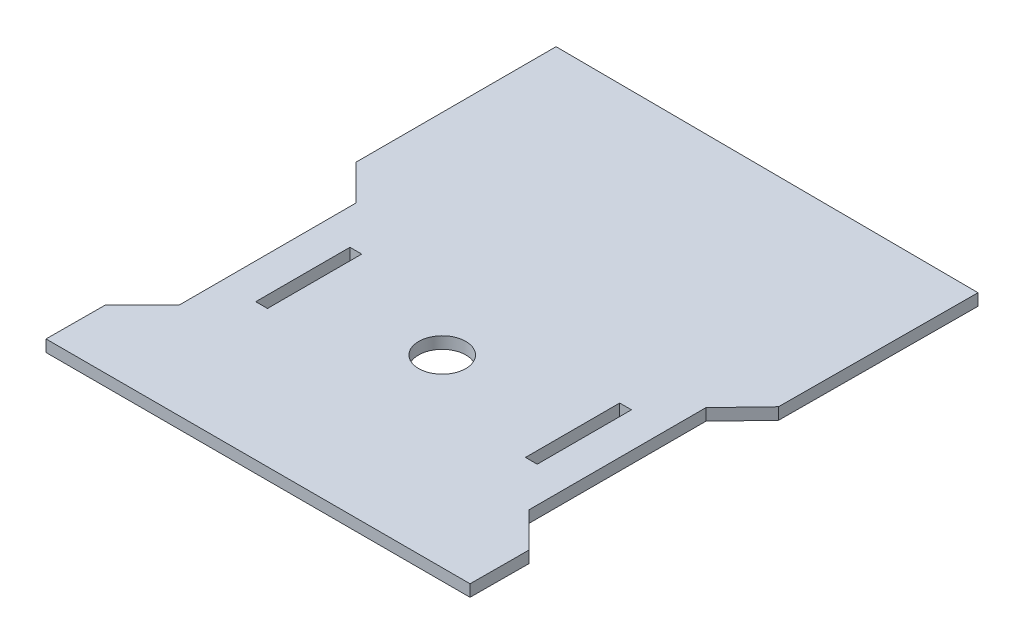
ISO-10303-21;
HEADER;
FILE_DESCRIPTION(('STEP AP214'),'2;1');
FILE_NAME('part.step','',(''),(''),'','','');
FILE_SCHEMA(('AUTOMOTIVE_DESIGN { 1 0 10303 214 1 1 1 1 }'));
ENDSEC;
DATA;
#1=APPLICATION_CONTEXT('core data for automotive mechanical design processes');
#2=APPLICATION_PROTOCOL_DEFINITION('international standard','automotive_design',2000,#1);
#3=PRODUCT_CONTEXT('',#1,'mechanical');
#4=PRODUCT('Part','Part','',(#3));
#5=PRODUCT_RELATED_PRODUCT_CATEGORY('part','',(#4));
#6=PRODUCT_DEFINITION_FORMATION('','',#4);
#7=PRODUCT_DEFINITION_CONTEXT('part definition',#1,'design');
#8=PRODUCT_DEFINITION('design','',#6,#7);
#9=PRODUCT_DEFINITION_SHAPE('','',#8);
#10=(LENGTH_UNIT() NAMED_UNIT(*) SI_UNIT(.MILLI.,.METRE.));
#11=(NAMED_UNIT(*) PLANE_ANGLE_UNIT() SI_UNIT($,.RADIAN.));
#12=(NAMED_UNIT(*) SI_UNIT($,.STERADIAN.) SOLID_ANGLE_UNIT());
#13=UNCERTAINTY_MEASURE_WITH_UNIT(LENGTH_MEASURE(1.E-05),#10,'distance_accuracy_value','');
#14=(GEOMETRIC_REPRESENTATION_CONTEXT(3) GLOBAL_UNCERTAINTY_ASSIGNED_CONTEXT((#13)) GLOBAL_UNIT_ASSIGNED_CONTEXT((#10,
#11,#12)) REPRESENTATION_CONTEXT('',''));
#15=CARTESIAN_POINT('',(0.,0.,0.));
#16=DIRECTION('',(0.,0.,1.));
#17=DIRECTION('',(1.,0.,0.));
#18=AXIS2_PLACEMENT_3D('',#15,#16,#17);
#19=CARTESIAN_POINT('',(-124.760229313885,5.,-28.8095600662507));
#20=DIRECTION('',(1.,0.,0.));
#21=DIRECTION('',(0.,0.,-1.));
#22=AXIS2_PLACEMENT_3D('',#19,#20,#21);
#23=PLANE('',#22);
#24=DIRECTION('',(0.,0.,1.));
#25=VECTOR('',#24,1.);
#26=CARTESIAN_POINT('',(-124.760229313885,0.,-28.8095600662507));
#27=LINE('',#26,#25);
#28=CARTESIAN_POINT('',(-124.760229313885,0.,-128.809560066251));
#29=VERTEX_POINT('',#28);
#30=CARTESIAN_POINT('',(-124.760229313885,0.,-43.8095600662505));
#31=VERTEX_POINT('',#30);
#32=EDGE_CURVE('E231',#29,#31,#27,.T.);
#33=ORIENTED_EDGE('',*,*,#32,.T.);
#34=DIRECTION('',(0.,1.,0.));
#35=VECTOR('',#34,1.);
#36=CARTESIAN_POINT('',(-124.760229313885,0.,-43.8095600662505));
#37=LINE('',#36,#35);
#38=CARTESIAN_POINT('',(-124.760229313885,5.,-43.8095600662505));
#39=VERTEX_POINT('',#38);
#40=EDGE_CURVE('E225',#31,#39,#37,.T.);
#41=ORIENTED_EDGE('',*,*,#40,.T.);
#42=DIRECTION('',(0.,0.,1.));
#43=VECTOR('',#42,1.);
#44=CARTESIAN_POINT('',(-124.760229313885,5.,-28.8095600662507));
#45=LINE('',#44,#43);
#46=CARTESIAN_POINT('',(-124.760229313885,5.,-128.809560066251));
#47=VERTEX_POINT('',#46);
#48=EDGE_CURVE('E237',#47,#39,#45,.T.);
#49=ORIENTED_EDGE('',*,*,#48,.F.);
#50=DIRECTION('',(0.,-1.,0.));
#51=VECTOR('',#50,1.);
#52=CARTESIAN_POINT('',(-124.760229313885,5.,-128.809560066251));
#53=LINE('',#52,#51);
#54=EDGE_CURVE('E260',#47,#29,#53,.T.);
#55=ORIENTED_EDGE('',*,*,#54,.T.);
#56=EDGE_LOOP('',(#33,#41,#49,#55));
#57=FACE_BOUND('',#56,.T.);
#58=ADVANCED_FACE('F33',(#57),#23,.F.);
#59=CARTESIAN_POINT('',(-109.760229313885,5.,46.1904399337493));
#60=DIRECTION('',(1.,0.,0.));
#61=DIRECTION('',(0.,0.,-1.));
#62=AXIS2_PLACEMENT_3D('',#59,#60,#61);
#63=PLANE('',#62);
#64=DIRECTION('',(0.,0.,1.));
#65=VECTOR('',#64,1.);
#66=CARTESIAN_POINT('',(-109.760229313885,0.,46.1904399337493));
#67=LINE('',#66,#65);
#68=CARTESIAN_POINT('',(-109.760229313885,0.,-28.8095600662507));
#69=VERTEX_POINT('',#68);
#70=CARTESIAN_POINT('',(-109.760229313885,0.,46.1904399337493));
#71=VERTEX_POINT('',#70);
#72=EDGE_CURVE('E263',#69,#71,#67,.T.);
#73=ORIENTED_EDGE('',*,*,#72,.T.);
#74=DIRECTION('',(0.,-1.,0.));
#75=VECTOR('',#74,1.);
#76=CARTESIAN_POINT('',(-109.760229313885,5.,46.1904399337493));
#77=LINE('',#76,#75);
#78=CARTESIAN_POINT('',(-109.760229313885,5.,46.1904399337493));
#79=VERTEX_POINT('',#78);
#80=EDGE_CURVE('E303',#79,#71,#77,.T.);
#81=ORIENTED_EDGE('',*,*,#80,.F.);
#82=DIRECTION('',(0.,0.,1.));
#83=VECTOR('',#82,1.);
#84=CARTESIAN_POINT('',(-109.760229313885,5.,46.1904399337493));
#85=LINE('',#84,#83);
#86=CARTESIAN_POINT('',(-109.760229313885,5.,-28.8095600662507));
#87=VERTEX_POINT('',#86);
#88=EDGE_CURVE('E240',#87,#79,#85,.T.);
#89=ORIENTED_EDGE('',*,*,#88,.F.);
#90=DIRECTION('',(0.,-1.,0.));
#91=VECTOR('',#90,1.);
#92=CARTESIAN_POINT('',(-109.760229313885,5.,-28.8095600662507));
#93=LINE('',#92,#91);
#94=EDGE_CURVE('E306',#87,#69,#93,.T.);
#95=ORIENTED_EDGE('',*,*,#94,.T.);
#96=EDGE_LOOP('',(#73,#81,#89,#95));
#97=FACE_BOUND('',#96,.T.);
#98=ADVANCED_FACE('F346',(#97),#63,.F.);
#99=CARTESIAN_POINT('',(-125.457265463883,5.,61.8874760837466));
#100=DIRECTION('',(0.707106781186546,0.,0.707106781186549));
#101=DIRECTION('',(0.707106781186549,0.,-0.707106781186546));
#102=AXIS2_PLACEMENT_3D('',#99,#100,#101);
#103=PLANE('',#102);
#104=DIRECTION('',(-0.707106781186549,0.,0.707106781186546));
#105=VECTOR('',#104,1.);
#106=CARTESIAN_POINT('',(-125.457265463883,0.,61.8874760837466));
#107=LINE('',#106,#105);
#108=CARTESIAN_POINT('',(-125.457265463883,0.,61.8874760837466));
#109=VERTEX_POINT('',#108);
#110=EDGE_CURVE('E265',#71,#109,#107,.T.);
#111=ORIENTED_EDGE('',*,*,#110,.T.);
#112=DIRECTION('',(0.,-1.,0.));
#113=VECTOR('',#112,1.);
#114=CARTESIAN_POINT('',(-125.457265463883,5.,61.8874760837466));
#115=LINE('',#114,#113);
#116=CARTESIAN_POINT('',(-125.457265463883,5.,61.8874760837466));
#117=VERTEX_POINT('',#116);
#118=EDGE_CURVE('E300',#117,#109,#115,.T.);
#119=ORIENTED_EDGE('',*,*,#118,.F.);
#120=DIRECTION('',(-0.707106781186549,0.,0.707106781186546));
#121=VECTOR('',#120,1.);
#122=CARTESIAN_POINT('',(-125.457265463883,5.,61.8874760837466));
#123=LINE('',#122,#121);
#124=EDGE_CURVE('E243',#79,#117,#123,.T.);
#125=ORIENTED_EDGE('',*,*,#124,.F.);
#126=ORIENTED_EDGE('',*,*,#80,.T.);
#127=EDGE_LOOP('',(#111,#119,#125,#126));
#128=FACE_BOUND('',#127,.T.);
#129=ADVANCED_FACE('F351',(#128),#103,.F.);
#130=CARTESIAN_POINT('',(-125.581736204954,5.,86.8874760837466));
#131=DIRECTION('',(0.99998760585812,0.,0.00497876793451781));
#132=DIRECTION('',(0.00497876793451781,0.,-0.99998760585812));
#133=AXIS2_PLACEMENT_3D('',#130,#131,#132);
#134=PLANE('',#133);
#135=DIRECTION('',(-0.00497876793451781,0.,0.99998760585812));
#136=VECTOR('',#135,1.);
#137=CARTESIAN_POINT('',(-125.581736204954,0.,86.8874760837466));
#138=LINE('',#137,#136);
#139=CARTESIAN_POINT('',(-125.581736204954,0.,86.8874760837466));
#140=VERTEX_POINT('',#139);
#141=EDGE_CURVE('E267',#109,#140,#138,.T.);
#142=ORIENTED_EDGE('',*,*,#141,.T.);
#143=DIRECTION('',(0.,-1.,0.));
#144=VECTOR('',#143,1.);
#145=CARTESIAN_POINT('',(-125.581736204954,5.,86.8874760837466));
#146=LINE('',#145,#144);
#147=CARTESIAN_POINT('',(-125.581736204954,5.,86.8874760837466));
#148=VERTEX_POINT('',#147);
#149=EDGE_CURVE('E297',#148,#140,#146,.T.);
#150=ORIENTED_EDGE('',*,*,#149,.F.);
#151=DIRECTION('',(-0.00497876793451781,0.,0.99998760585812));
#152=VECTOR('',#151,1.);
#153=CARTESIAN_POINT('',(-125.581736204954,5.,86.8874760837466));
#154=LINE('',#153,#152);
#155=EDGE_CURVE('E245',#117,#148,#154,.T.);
#156=ORIENTED_EDGE('',*,*,#155,.F.);
#157=ORIENTED_EDGE('',*,*,#118,.T.);
#158=EDGE_LOOP('',(#142,#150,#156,#157));
#159=FACE_BOUND('',#158,.T.);
#160=ADVANCED_FACE('F403',(#159),#134,.F.);
#161=CARTESIAN_POINT('',(54.4182637950463,5.,86.8874760837466));
#162=DIRECTION('',(0.,0.,-1.));
#163=DIRECTION('',(-1.,0.,0.));
#164=AXIS2_PLACEMENT_3D('',#161,#162,#163);
#165=PLANE('',#164);
#166=DIRECTION('',(1.,0.,0.));
#167=VECTOR('',#166,1.);
#168=CARTESIAN_POINT('',(54.4182637950463,0.,86.8874760837466));
#169=LINE('',#168,#167);
#170=CARTESIAN_POINT('',(54.4182637950463,0.,86.8874760837466));
#171=VERTEX_POINT('',#170);
#172=EDGE_CURVE('E269',#140,#171,#169,.T.);
#173=ORIENTED_EDGE('',*,*,#172,.T.);
#174=DIRECTION('',(0.,-1.,0.));
#175=VECTOR('',#174,1.);
#176=CARTESIAN_POINT('',(54.4182637950463,5.,86.8874760837466));
#177=LINE('',#176,#175);
#178=CARTESIAN_POINT('',(54.4182637950463,5.,86.8874760837466));
#179=VERTEX_POINT('',#178);
#180=EDGE_CURVE('E294',#179,#171,#177,.T.);
#181=ORIENTED_EDGE('',*,*,#180,.F.);
#182=DIRECTION('',(1.,0.,0.));
#183=VECTOR('',#182,1.);
#184=CARTESIAN_POINT('',(54.4182637950463,5.,86.8874760837466));
#185=LINE('',#184,#183);
#186=EDGE_CURVE('E247',#148,#179,#185,.T.);
#187=ORIENTED_EDGE('',*,*,#186,.F.);
#188=ORIENTED_EDGE('',*,*,#149,.T.);
#189=EDGE_LOOP('',(#173,#181,#187,#188));
#190=FACE_BOUND('',#189,.T.);
#191=ADVANCED_FACE('F399',(#190),#165,.F.);
#192=CARTESIAN_POINT('',(54.5427345361172,5.,61.8874760837467));
#193=DIRECTION('',(-0.99998760585812,0.,-0.0049787679345167));
#194=DIRECTION('',(-0.0049787679345167,0.,0.99998760585812));
#195=AXIS2_PLACEMENT_3D('',#192,#193,#194);
#196=PLANE('',#195);
#197=DIRECTION('',(0.0049787679345167,0.,-0.99998760585812));
#198=VECTOR('',#197,1.);
#199=CARTESIAN_POINT('',(54.5427345361172,0.,61.8874760837467));
#200=LINE('',#199,#198);
#201=CARTESIAN_POINT('',(54.5427345361172,0.,61.8874760837467));
#202=VERTEX_POINT('',#201);
#203=EDGE_CURVE('E271',#171,#202,#200,.T.);
#204=ORIENTED_EDGE('',*,*,#203,.T.);
#205=DIRECTION('',(0.,-1.,0.));
#206=VECTOR('',#205,1.);
#207=CARTESIAN_POINT('',(54.5427345361172,5.,61.8874760837467));
#208=LINE('',#207,#206);
#209=CARTESIAN_POINT('',(54.5427345361172,5.,61.8874760837467));
#210=VERTEX_POINT('',#209);
#211=EDGE_CURVE('E291',#210,#202,#208,.T.);
#212=ORIENTED_EDGE('',*,*,#211,.F.);
#213=DIRECTION('',(0.0049787679345167,0.,-0.99998760585812));
#214=VECTOR('',#213,1.);
#215=CARTESIAN_POINT('',(54.5427345361172,5.,61.8874760837467));
#216=LINE('',#215,#214);
#217=EDGE_CURVE('E249',#179,#210,#216,.T.);
#218=ORIENTED_EDGE('',*,*,#217,.F.);
#219=ORIENTED_EDGE('',*,*,#180,.T.);
#220=EDGE_LOOP('',(#204,#212,#218,#219));
#221=FACE_BOUND('',#220,.T.);
#222=ADVANCED_FACE('F394',(#221),#196,.F.);
#223=CARTESIAN_POINT('',(39.7418877218308,5.,47.0866292694603));
#224=DIRECTION('',(-0.707106781186547,0.,0.707106781186548));
#225=DIRECTION('',(0.707106781186548,0.,0.707106781186547));
#226=AXIS2_PLACEMENT_3D('',#223,#224,#225);
#227=PLANE('',#226);
#228=DIRECTION('',(-0.707106781186548,0.,-0.707106781186547));
#229=VECTOR('',#228,1.);
#230=CARTESIAN_POINT('',(39.7418877218308,0.,47.0866292694603));
#231=LINE('',#230,#229);
#232=CARTESIAN_POINT('',(39.7418877218308,0.,47.0866292694603));
#233=VERTEX_POINT('',#232);
#234=EDGE_CURVE('E273',#202,#233,#231,.T.);
#235=ORIENTED_EDGE('',*,*,#234,.T.);
#236=DIRECTION('',(0.,-1.,0.));
#237=VECTOR('',#236,1.);
#238=CARTESIAN_POINT('',(39.7418877218308,5.,47.0866292694603));
#239=LINE('',#238,#237);
#240=CARTESIAN_POINT('',(39.7418877218308,5.,47.0866292694603));
#241=VERTEX_POINT('',#240);
#242=EDGE_CURVE('E288',#241,#233,#239,.T.);
#243=ORIENTED_EDGE('',*,*,#242,.F.);
#244=DIRECTION('',(-0.707106781186548,0.,-0.707106781186547));
#245=VECTOR('',#244,1.);
#246=CARTESIAN_POINT('',(39.7418877218308,5.,47.0866292694603));
#247=LINE('',#246,#245);
#248=EDGE_CURVE('E251',#210,#241,#247,.T.);
#249=ORIENTED_EDGE('',*,*,#248,.F.);
#250=ORIENTED_EDGE('',*,*,#211,.T.);
#251=EDGE_LOOP('',(#235,#243,#249,#250));
#252=FACE_BOUND('',#251,.T.);
#253=ADVANCED_FACE('F388',(#252),#227,.F.);
#254=CARTESIAN_POINT('',(39.7418877218308,5.,-27.9133707305397));
#255=DIRECTION('',(-1.,0.,0.));
#256=DIRECTION('',(0.,0.,1.));
#257=AXIS2_PLACEMENT_3D('',#254,#255,#256);
#258=PLANE('',#257);
#259=DIRECTION('',(0.,0.,-1.));
#260=VECTOR('',#259,1.);
#261=CARTESIAN_POINT('',(39.7418877218308,0.,-27.9133707305397));
#262=LINE('',#261,#260);
#263=CARTESIAN_POINT('',(39.7418877218308,0.,-27.9133707305397));
#264=VERTEX_POINT('',#263);
#265=EDGE_CURVE('E275',#233,#264,#262,.T.);
#266=ORIENTED_EDGE('',*,*,#265,.T.);
#267=DIRECTION('',(0.,-1.,0.));
#268=VECTOR('',#267,1.);
#269=CARTESIAN_POINT('',(39.7418877218308,5.,-27.9133707305397));
#270=LINE('',#269,#268);
#271=CARTESIAN_POINT('',(39.7418877218308,5.,-27.9133707305397));
#272=VERTEX_POINT('',#271);
#273=EDGE_CURVE('E286',#272,#264,#270,.T.);
#274=ORIENTED_EDGE('',*,*,#273,.F.);
#275=DIRECTION('',(0.,0.,-1.));
#276=VECTOR('',#275,1.);
#277=CARTESIAN_POINT('',(39.7418877218308,5.,-27.9133707305397));
#278=LINE('',#277,#276);
#279=EDGE_CURVE('E253',#241,#272,#278,.T.);
#280=ORIENTED_EDGE('',*,*,#279,.F.);
#281=ORIENTED_EDGE('',*,*,#242,.T.);
#282=EDGE_LOOP('',(#266,#274,#280,#281));
#283=FACE_BOUND('',#282,.T.);
#284=ADVANCED_FACE('F383',(#283),#258,.F.);
#285=CARTESIAN_POINT('',(55.2397706861146,5.,-127.91337073054));
#286=DIRECTION('',(-0.99998760585812,0.,-0.00497876793451739));
#287=DIRECTION('',(-0.00497876793451739,0.,0.99998760585812));
#288=AXIS2_PLACEMENT_3D('',#285,#286,#287);
#289=PLANE('',#288);
#290=DIRECTION('',(0.00497876793451739,0.,-0.99998760585812));
#291=VECTOR('',#290,1.);
#292=CARTESIAN_POINT('',(55.2397706861146,5.,-127.91337073054));
#293=LINE('',#292,#291);
#294=CARTESIAN_POINT('',(54.8203274115754,5.,-43.6680149685605));
#295=VERTEX_POINT('',#294);
#296=CARTESIAN_POINT('',(55.2397706861146,5.,-127.91337073054));
#297=VERTEX_POINT('',#296);
#298=EDGE_CURVE('E256',#295,#297,#293,.T.);
#299=ORIENTED_EDGE('',*,*,#298,.F.);
#300=DIRECTION('',(0.,1.,0.));
#301=VECTOR('',#300,1.);
#302=CARTESIAN_POINT('',(54.8203274115754,0.,-43.6680149685605));
#303=LINE('',#302,#301);
#304=CARTESIAN_POINT('',(54.8203274115754,0.,-43.6680149685605));
#305=VERTEX_POINT('',#304);
#306=EDGE_CURVE('E228',#305,#295,#303,.T.);
#307=ORIENTED_EDGE('',*,*,#306,.F.);
#308=DIRECTION('',(0.00497876793451739,0.,-0.99998760585812));
#309=VECTOR('',#308,1.);
#310=CARTESIAN_POINT('',(55.2397706861146,0.,-127.91337073054));
#311=LINE('',#310,#309);
#312=CARTESIAN_POINT('',(55.2397706861146,0.,-127.91337073054));
#313=VERTEX_POINT('',#312);
#314=EDGE_CURVE('E278',#305,#313,#311,.T.);
#315=ORIENTED_EDGE('',*,*,#314,.T.);
#316=DIRECTION('',(0.,-1.,0.));
#317=VECTOR('',#316,1.);
#318=CARTESIAN_POINT('',(55.2397706861146,5.,-127.91337073054));
#319=LINE('',#318,#317);
#320=EDGE_CURVE('E283',#297,#313,#319,.T.);
#321=ORIENTED_EDGE('',*,*,#320,.F.);
#322=EDGE_LOOP('',(#299,#307,#315,#321));
#323=FACE_BOUND('',#322,.T.);
#324=ADVANCED_FACE('F376',(#323),#289,.F.);
#325=CARTESIAN_POINT('',(-124.760229313885,5.,-128.809560066251));
#326=DIRECTION('',(-0.00497876793451747,0.,0.99998760585812));
#327=DIRECTION('',(0.99998760585812,0.,0.00497876793451747));
#328=AXIS2_PLACEMENT_3D('',#325,#326,#327);
#329=PLANE('',#328);
#330=DIRECTION('',(-0.99998760585812,0.,-0.00497876793451747));
#331=VECTOR('',#330,1.);
#332=CARTESIAN_POINT('',(-124.760229313885,0.,-128.809560066251));
#333=LINE('',#332,#331);
#334=EDGE_CURVE('E241',#313,#29,#333,.T.);
#335=ORIENTED_EDGE('',*,*,#334,.T.);
#336=ORIENTED_EDGE('',*,*,#54,.F.);
#337=DIRECTION('',(-0.99998760585812,0.,-0.00497876793451747));
#338=VECTOR('',#337,1.);
#339=CARTESIAN_POINT('',(-124.760229313885,5.,-128.809560066251));
#340=LINE('',#339,#338);
#341=EDGE_CURVE('E258',#297,#47,#340,.T.);
#342=ORIENTED_EDGE('',*,*,#341,.F.);
#343=ORIENTED_EDGE('',*,*,#320,.T.);
#344=EDGE_LOOP('',(#335,#336,#342,#343));
#345=FACE_BOUND('',#344,.T.);
#346=ADVANCED_FACE('F374',(#345),#329,.F.);
#347=CARTESIAN_POINT('',(0.,5.,0.));
#348=DIRECTION('',(0.,1.,0.));
#349=DIRECTION('',(0.,0.,1.));
#350=AXIS2_PLACEMENT_3D('',#347,#348,#349);
#351=PLANE('',#350);
#352=CARTESIAN_POINT('',(-35.5817362049537,5.,8.69043993374934));
#353=DIRECTION('',(0.,1.,0.));
#354=DIRECTION('',(0.,0.,1.));
#355=AXIS2_PLACEMENT_3D('',#352,#353,#354);
#356=CIRCLE('',#355,10.);
#357=CARTESIAN_POINT('',(-35.5817362049537,5.,18.6904399337493));
#358=VERTEX_POINT('',#357);
#359=EDGE_CURVE('E517',#358,#358,#356,.T.);
#360=ORIENTED_EDGE('',*,*,#359,.F.);
#361=EDGE_LOOP('',(#360));
#362=FACE_BOUND('',#361,.T.);
#363=DIRECTION('',(0.,0.,1.));
#364=VECTOR('',#363,1.);
#365=CARTESIAN_POINT('',(-94.7602293138854,5.,-11.3095600662507));
#366=LINE('',#365,#364);
#367=CARTESIAN_POINT('',(-94.7602293138854,5.,-11.3095600662507));
#368=VERTEX_POINT('',#367);
#369=CARTESIAN_POINT('',(-94.7602293138854,5.,28.6904399337493));
#370=VERTEX_POINT('',#369);
#371=EDGE_CURVE('E48',#368,#370,#366,.T.);
#372=ORIENTED_EDGE('',*,*,#371,.F.);
#373=DIRECTION('',(-1.,0.,0.));
#374=VECTOR('',#373,1.);
#375=CARTESIAN_POINT('',(-89.7602293138854,5.,-11.3095600662507));
#376=LINE('',#375,#374);
#377=CARTESIAN_POINT('',(-89.7602293138854,5.,-11.3095600662507));
#378=VERTEX_POINT('',#377);
#379=EDGE_CURVE('E194',#378,#368,#376,.T.);
#380=ORIENTED_EDGE('',*,*,#379,.F.);
#381=DIRECTION('',(0.,0.,-1.));
#382=VECTOR('',#381,1.);
#383=CARTESIAN_POINT('',(-89.7602293138854,5.,-11.3095600662507));
#384=LINE('',#383,#382);
#385=CARTESIAN_POINT('',(-89.7602293138854,5.,28.6904399337493));
#386=VERTEX_POINT('',#385);
#387=EDGE_CURVE('E177',#386,#378,#384,.T.);
#388=ORIENTED_EDGE('',*,*,#387,.F.);
#389=DIRECTION('',(1.,0.,0.));
#390=VECTOR('',#389,1.);
#391=CARTESIAN_POINT('',(-89.7602293138854,5.,28.6904399337493));
#392=LINE('',#391,#390);
#393=EDGE_CURVE('E187',#370,#386,#392,.T.);
#394=ORIENTED_EDGE('',*,*,#393,.F.);
#395=EDGE_LOOP('',(#372,#380,#388,#394));
#396=FACE_BOUND('',#395,.T.);
#397=DIRECTION('',(0.,0.,-1.));
#398=VECTOR('',#397,1.);
#399=CARTESIAN_POINT('',(24.7418877218308,5.,28.6904399337493));
#400=LINE('',#399,#398);
#401=CARTESIAN_POINT('',(24.7418877218308,5.,28.6904399337493));
#402=VERTEX_POINT('',#401);
#403=CARTESIAN_POINT('',(24.7418877218308,5.,-11.3095600662507));
#404=VERTEX_POINT('',#403);
#405=EDGE_CURVE('E56',#402,#404,#400,.T.);
#406=ORIENTED_EDGE('',*,*,#405,.F.);
#407=DIRECTION('',(1.,0.,0.));
#408=VECTOR('',#407,1.);
#409=CARTESIAN_POINT('',(19.7418877218308,5.,28.6904399337493));
#410=LINE('',#409,#408);
#411=CARTESIAN_POINT('',(19.7418877218308,5.,28.6904399337493));
#412=VERTEX_POINT('',#411);
#413=EDGE_CURVE('E211',#412,#402,#410,.T.);
#414=ORIENTED_EDGE('',*,*,#413,.F.);
#415=DIRECTION('',(0.,0.,1.));
#416=VECTOR('',#415,1.);
#417=CARTESIAN_POINT('',(19.7418877218308,5.,28.6904399337493));
#418=LINE('',#417,#416);
#419=CARTESIAN_POINT('',(19.7418877218308,5.,-11.3095600662507));
#420=VERTEX_POINT('',#419);
#421=EDGE_CURVE('E208',#420,#412,#418,.T.);
#422=ORIENTED_EDGE('',*,*,#421,.F.);
#423=DIRECTION('',(-1.,0.,0.));
#424=VECTOR('',#423,1.);
#425=CARTESIAN_POINT('',(19.7418877218308,5.,-11.3095600662507));
#426=LINE('',#425,#424);
#427=EDGE_CURVE('E205',#404,#420,#426,.T.);
#428=ORIENTED_EDGE('',*,*,#427,.F.);
#429=EDGE_LOOP('',(#406,#414,#422,#428));
#430=FACE_BOUND('',#429,.T.);
#431=DIRECTION('',(-0.707106781186552,0.,-0.707106781186543));
#432=VECTOR('',#431,1.);
#433=CARTESIAN_POINT('',(-109.760229313885,5.,-28.8095600662507));
#434=LINE('',#433,#432);
#435=EDGE_CURVE('E226',#87,#39,#434,.T.);
#436=ORIENTED_EDGE('',*,*,#435,.F.);
#437=ORIENTED_EDGE('',*,*,#88,.T.);
#438=ORIENTED_EDGE('',*,*,#124,.T.);
#439=ORIENTED_EDGE('',*,*,#155,.T.);
#440=ORIENTED_EDGE('',*,*,#186,.T.);
#441=ORIENTED_EDGE('',*,*,#217,.T.);
#442=ORIENTED_EDGE('',*,*,#248,.T.);
#443=ORIENTED_EDGE('',*,*,#279,.T.);
#444=DIRECTION('',(-0.691432865527096,0.,0.722440718999829));
#445=VECTOR('',#444,1.);
#446=CARTESIAN_POINT('',(39.7418877218308,5.,-27.9133707305397));
#447=LINE('',#446,#445);
#448=EDGE_CURVE('E201',#295,#272,#447,.T.);
#449=ORIENTED_EDGE('',*,*,#448,.F.);
#450=ORIENTED_EDGE('',*,*,#298,.T.);
#451=ORIENTED_EDGE('',*,*,#341,.T.);
#452=ORIENTED_EDGE('',*,*,#48,.T.);
#453=EDGE_LOOP('',(#436,#437,#438,#439,#440,#441,#442,#443,#449,#450,#451,#452));
#454=FACE_BOUND('',#453,.T.);
#455=ADVANCED_FACE('F191',(#362,#396,#430,#454),#351,.T.);
#456=CARTESIAN_POINT('',(0.,0.,0.));
#457=DIRECTION('',(0.,1.,0.));
#458=DIRECTION('',(0.,0.,1.));
#459=AXIS2_PLACEMENT_3D('',#456,#457,#458);
#460=PLANE('',#459);
#461=CARTESIAN_POINT('',(-35.5817362049537,0.,8.69043993374934));
#462=DIRECTION('',(0.,1.,0.));
#463=DIRECTION('',(0.,0.,1.));
#464=AXIS2_PLACEMENT_3D('',#461,#462,#463);
#465=CIRCLE('',#464,10.);
#466=CARTESIAN_POINT('',(-35.5817362049537,0.,18.6904399337493));
#467=VERTEX_POINT('',#466);
#468=EDGE_CURVE('E36',#467,#467,#465,.T.);
#469=ORIENTED_EDGE('',*,*,#468,.T.);
#470=EDGE_LOOP('',(#469));
#471=FACE_BOUND('',#470,.T.);
#472=DIRECTION('',(-1.,0.,0.));
#473=VECTOR('',#472,1.);
#474=CARTESIAN_POINT('',(0.,0.,-11.3095600662507));
#475=LINE('',#474,#473);
#476=CARTESIAN_POINT('',(-89.7602293138854,0.,-11.3095600662507));
#477=VERTEX_POINT('',#476);
#478=CARTESIAN_POINT('',(-94.7602293138854,0.,-11.3095600662507));
#479=VERTEX_POINT('',#478);
#480=EDGE_CURVE('E41',#477,#479,#475,.T.);
#481=ORIENTED_EDGE('',*,*,#480,.T.);
#482=DIRECTION('',(0.,0.,1.));
#483=VECTOR('',#482,1.);
#484=CARTESIAN_POINT('',(-94.7602293138854,0.,0.));
#485=LINE('',#484,#483);
#486=CARTESIAN_POINT('',(-94.7602293138854,0.,28.6904399337493));
#487=VERTEX_POINT('',#486);
#488=EDGE_CURVE('E11',#479,#487,#485,.T.);
#489=ORIENTED_EDGE('',*,*,#488,.T.);
#490=DIRECTION('',(1.,0.,0.));
#491=VECTOR('',#490,1.);
#492=CARTESIAN_POINT('',(0.,0.,28.6904399337493));
#493=LINE('',#492,#491);
#494=CARTESIAN_POINT('',(-89.7602293138854,0.,28.6904399337493));
#495=VERTEX_POINT('',#494);
#496=EDGE_CURVE('E321',#487,#495,#493,.T.);
#497=ORIENTED_EDGE('',*,*,#496,.T.);
#498=DIRECTION('',(0.,0.,-1.));
#499=VECTOR('',#498,1.);
#500=CARTESIAN_POINT('',(-89.7602293138854,0.,0.));
#501=LINE('',#500,#499);
#502=EDGE_CURVE('E180',#495,#477,#501,.T.);
#503=ORIENTED_EDGE('',*,*,#502,.T.);
#504=EDGE_LOOP('',(#481,#489,#497,#503));
#505=FACE_BOUND('',#504,.T.);
#506=DIRECTION('',(1.,0.,0.));
#507=VECTOR('',#506,1.);
#508=CARTESIAN_POINT('',(0.,0.,28.6904399337493));
#509=LINE('',#508,#507);
#510=CARTESIAN_POINT('',(19.7418877218308,0.,28.6904399337493));
#511=VERTEX_POINT('',#510);
#512=CARTESIAN_POINT('',(24.7418877218308,0.,28.6904399337493));
#513=VERTEX_POINT('',#512);
#514=EDGE_CURVE('E315',#511,#513,#509,.T.);
#515=ORIENTED_EDGE('',*,*,#514,.T.);
#516=DIRECTION('',(0.,0.,-1.));
#517=VECTOR('',#516,1.);
#518=CARTESIAN_POINT('',(24.7418877218308,0.,0.));
#519=LINE('',#518,#517);
#520=CARTESIAN_POINT('',(24.7418877218308,0.,-11.3095600662507));
#521=VERTEX_POINT('',#520);
#522=EDGE_CURVE('E318',#513,#521,#519,.T.);
#523=ORIENTED_EDGE('',*,*,#522,.T.);
#524=DIRECTION('',(-1.,0.,0.));
#525=VECTOR('',#524,1.);
#526=CARTESIAN_POINT('',(0.,0.,-11.3095600662507));
#527=LINE('',#526,#525);
#528=CARTESIAN_POINT('',(19.7418877218308,0.,-11.3095600662507));
#529=VERTEX_POINT('',#528);
#530=EDGE_CURVE('E309',#521,#529,#527,.T.);
#531=ORIENTED_EDGE('',*,*,#530,.T.);
#532=DIRECTION('',(0.,0.,1.));
#533=VECTOR('',#532,1.);
#534=CARTESIAN_POINT('',(19.7418877218308,0.,0.));
#535=LINE('',#534,#533);
#536=EDGE_CURVE('E312',#529,#511,#535,.T.);
#537=ORIENTED_EDGE('',*,*,#536,.T.);
#538=EDGE_LOOP('',(#515,#523,#531,#537));
#539=FACE_BOUND('',#538,.T.);
#540=ORIENTED_EDGE('',*,*,#72,.F.);
#541=DIRECTION('',(-0.707106781186552,0.,-0.707106781186543));
#542=VECTOR('',#541,1.);
#543=CARTESIAN_POINT('',(-109.760229313885,0.,-28.8095600662507));
#544=LINE('',#543,#542);
#545=EDGE_CURVE('E222',#69,#31,#544,.T.);
#546=ORIENTED_EDGE('',*,*,#545,.T.);
#547=ORIENTED_EDGE('',*,*,#32,.F.);
#548=ORIENTED_EDGE('',*,*,#334,.F.);
#549=ORIENTED_EDGE('',*,*,#314,.F.);
#550=DIRECTION('',(-0.691432865527096,0.,0.722440718999829));
#551=VECTOR('',#550,1.);
#552=CARTESIAN_POINT('',(39.7418877218308,0.,-27.9133707305397));
#553=LINE('',#552,#551);
#554=EDGE_CURVE('E232',#305,#264,#553,.T.);
#555=ORIENTED_EDGE('',*,*,#554,.T.);
#556=ORIENTED_EDGE('',*,*,#265,.F.);
#557=ORIENTED_EDGE('',*,*,#234,.F.);
#558=ORIENTED_EDGE('',*,*,#203,.F.);
#559=ORIENTED_EDGE('',*,*,#172,.F.);
#560=ORIENTED_EDGE('',*,*,#141,.F.);
#561=ORIENTED_EDGE('',*,*,#110,.F.);
#562=EDGE_LOOP('',(#540,#546,#547,#548,#549,#555,#556,#557,#558,#559,#560,#561));
#563=FACE_BOUND('',#562,.T.);
#564=ADVANCED_FACE('F326',(#471,#505,#539,#563),#460,.F.);
#565=CARTESIAN_POINT('',(39.7418877218308,0.,-27.9133707305397));
#566=DIRECTION('',(-0.722440718999829,0.,-0.691432865527096));
#567=DIRECTION('',(-0.691432865527096,0.,0.722440718999829));
#568=AXIS2_PLACEMENT_3D('',#565,#566,#567);
#569=PLANE('',#568);
#570=ORIENTED_EDGE('',*,*,#448,.T.);
#571=ORIENTED_EDGE('',*,*,#273,.T.);
#572=ORIENTED_EDGE('',*,*,#554,.F.);
#573=ORIENTED_EDGE('',*,*,#306,.T.);
#574=EDGE_LOOP('',(#570,#571,#572,#573));
#575=FACE_BOUND('',#574,.T.);
#576=ADVANCED_FACE('F426',(#575),#569,.F.);
#577=CARTESIAN_POINT('',(-109.760229313885,0.,-28.8095600662507));
#578=DIRECTION('',(0.707106781186543,0.,-0.707106781186552));
#579=DIRECTION('',(-0.707106781186552,0.,-0.707106781186543));
#580=AXIS2_PLACEMENT_3D('',#577,#578,#579);
#581=PLANE('',#580);
#582=ORIENTED_EDGE('',*,*,#435,.T.);
#583=ORIENTED_EDGE('',*,*,#40,.F.);
#584=ORIENTED_EDGE('',*,*,#545,.F.);
#585=ORIENTED_EDGE('',*,*,#94,.F.);
#586=EDGE_LOOP('',(#582,#583,#584,#585));
#587=FACE_BOUND('',#586,.T.);
#588=ADVANCED_FACE('F362',(#587),#581,.F.);
#589=CARTESIAN_POINT('',(24.7418877218308,-5.,28.6904399337493));
#590=DIRECTION('',(1.,0.,0.));
#591=DIRECTION('',(0.,0.,-1.));
#592=AXIS2_PLACEMENT_3D('',#589,#590,#591);
#593=PLANE('',#592);
#594=DIRECTION('',(0.,1.,0.));
#595=VECTOR('',#594,1.);
#596=CARTESIAN_POINT('',(24.7418877218308,-5.,28.6904399337493));
#597=LINE('',#596,#595);
#598=EDGE_CURVE('E215',#513,#402,#597,.T.);
#599=ORIENTED_EDGE('',*,*,#598,.T.);
#600=ORIENTED_EDGE('',*,*,#405,.T.);
#601=DIRECTION('',(0.,1.,0.));
#602=VECTOR('',#601,1.);
#603=CARTESIAN_POINT('',(24.7418877218308,-5.,-11.3095600662507));
#604=LINE('',#603,#602);
#605=EDGE_CURVE('E214',#521,#404,#604,.T.);
#606=ORIENTED_EDGE('',*,*,#605,.F.);
#607=ORIENTED_EDGE('',*,*,#522,.F.);
#608=EDGE_LOOP('',(#599,#600,#606,#607));
#609=FACE_BOUND('',#608,.T.);
#610=ADVANCED_FACE('F435',(#609),#593,.F.);
#611=CARTESIAN_POINT('',(19.7418877218308,-5.,28.6904399337493));
#612=DIRECTION('',(0.,0.,1.));
#613=DIRECTION('',(1.,0.,0.));
#614=AXIS2_PLACEMENT_3D('',#611,#612,#613);
#615=PLANE('',#614);
#616=DIRECTION('',(0.,1.,0.));
#617=VECTOR('',#616,1.);
#618=CARTESIAN_POINT('',(19.7418877218308,-5.,28.6904399337493));
#619=LINE('',#618,#617);
#620=EDGE_CURVE('E217',#511,#412,#619,.T.);
#621=ORIENTED_EDGE('',*,*,#620,.T.);
#622=ORIENTED_EDGE('',*,*,#413,.T.);
#623=ORIENTED_EDGE('',*,*,#598,.F.);
#624=ORIENTED_EDGE('',*,*,#514,.F.);
#625=EDGE_LOOP('',(#621,#622,#623,#624));
#626=FACE_BOUND('',#625,.T.);
#627=ADVANCED_FACE('F437',(#626),#615,.F.);
#628=CARTESIAN_POINT('',(19.7418877218308,-5.,28.6904399337493));
#629=DIRECTION('',(-1.,0.,0.));
#630=DIRECTION('',(0.,0.,1.));
#631=AXIS2_PLACEMENT_3D('',#628,#629,#630);
#632=PLANE('',#631);
#633=DIRECTION('',(0.,1.,0.));
#634=VECTOR('',#633,1.);
#635=CARTESIAN_POINT('',(19.7418877218308,-5.,-11.3095600662507));
#636=LINE('',#635,#634);
#637=EDGE_CURVE('E219',#529,#420,#636,.T.);
#638=ORIENTED_EDGE('',*,*,#637,.T.);
#639=ORIENTED_EDGE('',*,*,#421,.T.);
#640=ORIENTED_EDGE('',*,*,#620,.F.);
#641=ORIENTED_EDGE('',*,*,#536,.F.);
#642=EDGE_LOOP('',(#638,#639,#640,#641));
#643=FACE_BOUND('',#642,.T.);
#644=ADVANCED_FACE('F340',(#643),#632,.F.);
#645=CARTESIAN_POINT('',(19.7418877218308,-5.,-11.3095600662507));
#646=DIRECTION('',(0.,0.,-1.));
#647=DIRECTION('',(-1.,0.,0.));
#648=AXIS2_PLACEMENT_3D('',#645,#646,#647);
#649=PLANE('',#648);
#650=ORIENTED_EDGE('',*,*,#605,.T.);
#651=ORIENTED_EDGE('',*,*,#427,.T.);
#652=ORIENTED_EDGE('',*,*,#637,.F.);
#653=ORIENTED_EDGE('',*,*,#530,.F.);
#654=EDGE_LOOP('',(#650,#651,#652,#653));
#655=FACE_BOUND('',#654,.T.);
#656=ADVANCED_FACE('F333',(#655),#649,.F.);
#657=CARTESIAN_POINT('',(-94.7602293138854,-5.,-11.3095600662507));
#658=DIRECTION('',(-1.,0.,0.));
#659=DIRECTION('',(0.,0.,1.));
#660=AXIS2_PLACEMENT_3D('',#657,#658,#659);
#661=PLANE('',#660);
#662=DIRECTION('',(0.,1.,0.));
#663=VECTOR('',#662,1.);
#664=CARTESIAN_POINT('',(-94.7602293138854,-5.,-11.3095600662507));
#665=LINE('',#664,#663);
#666=EDGE_CURVE('E199',#479,#368,#665,.T.);
#667=ORIENTED_EDGE('',*,*,#666,.T.);
#668=ORIENTED_EDGE('',*,*,#371,.T.);
#669=DIRECTION('',(0.,1.,0.));
#670=VECTOR('',#669,1.);
#671=CARTESIAN_POINT('',(-94.7602293138854,-5.,28.6904399337493));
#672=LINE('',#671,#670);
#673=EDGE_CURVE('E184',#487,#370,#672,.T.);
#674=ORIENTED_EDGE('',*,*,#673,.F.);
#675=ORIENTED_EDGE('',*,*,#488,.F.);
#676=EDGE_LOOP('',(#667,#668,#674,#675));
#677=FACE_BOUND('',#676,.T.);
#678=ADVANCED_FACE('F331',(#677),#661,.F.);
#679=CARTESIAN_POINT('',(-89.7602293138854,-5.,-11.3095600662507));
#680=DIRECTION('',(0.,0.,-1.));
#681=DIRECTION('',(-1.,0.,0.));
#682=AXIS2_PLACEMENT_3D('',#679,#680,#681);
#683=PLANE('',#682);
#684=DIRECTION('',(0.,1.,0.));
#685=VECTOR('',#684,1.);
#686=CARTESIAN_POINT('',(-89.7602293138854,-5.,-11.3095600662507));
#687=LINE('',#686,#685);
#688=EDGE_CURVE('E183',#477,#378,#687,.T.);
#689=ORIENTED_EDGE('',*,*,#688,.T.);
#690=ORIENTED_EDGE('',*,*,#379,.T.);
#691=ORIENTED_EDGE('',*,*,#666,.F.);
#692=ORIENTED_EDGE('',*,*,#480,.F.);
#693=EDGE_LOOP('',(#689,#690,#691,#692));
#694=FACE_BOUND('',#693,.T.);
#695=ADVANCED_FACE('F330',(#694),#683,.F.);
#696=CARTESIAN_POINT('',(-89.7602293138854,-5.,-11.3095600662507));
#697=DIRECTION('',(1.,0.,0.));
#698=DIRECTION('',(0.,0.,-1.));
#699=AXIS2_PLACEMENT_3D('',#696,#697,#698);
#700=PLANE('',#699);
#701=DIRECTION('',(0.,1.,0.));
#702=VECTOR('',#701,1.);
#703=CARTESIAN_POINT('',(-89.7602293138854,-5.,28.6904399337493));
#704=LINE('',#703,#702);
#705=EDGE_CURVE('E172',#495,#386,#704,.T.);
#706=ORIENTED_EDGE('',*,*,#705,.T.);
#707=ORIENTED_EDGE('',*,*,#387,.T.);
#708=ORIENTED_EDGE('',*,*,#688,.F.);
#709=ORIENTED_EDGE('',*,*,#502,.F.);
#710=EDGE_LOOP('',(#706,#707,#708,#709));
#711=FACE_BOUND('',#710,.T.);
#712=ADVANCED_FACE('F174',(#711),#700,.F.);
#713=CARTESIAN_POINT('',(-89.7602293138854,-5.,28.6904399337493));
#714=DIRECTION('',(0.,0.,1.));
#715=DIRECTION('',(1.,0.,0.));
#716=AXIS2_PLACEMENT_3D('',#713,#714,#715);
#717=PLANE('',#716);
#718=ORIENTED_EDGE('',*,*,#673,.T.);
#719=ORIENTED_EDGE('',*,*,#393,.T.);
#720=ORIENTED_EDGE('',*,*,#705,.F.);
#721=ORIENTED_EDGE('',*,*,#496,.F.);
#722=EDGE_LOOP('',(#718,#719,#720,#721));
#723=FACE_BOUND('',#722,.T.);
#724=ADVANCED_FACE('F188',(#723),#717,.F.);
#725=CARTESIAN_POINT('',(-35.5817362049537,-5.,8.69043993374934));
#726=DIRECTION('',(0.,1.,0.));
#727=DIRECTION('',(0.,0.,1.));
#728=AXIS2_PLACEMENT_3D('',#725,#726,#727);
#729=CYLINDRICAL_SURFACE('',#728,10.);
#730=ORIENTED_EDGE('',*,*,#359,.T.);
#731=EDGE_LOOP('',(#730));
#732=FACE_BOUND('',#731,.T.);
#733=ORIENTED_EDGE('',*,*,#468,.F.);
#734=EDGE_LOOP('',(#733));
#735=FACE_BOUND('',#734,.T.);
#736=ADVANCED_FACE('F488',(#732,#735),#729,.F.);
#737=CLOSED_SHELL('',(#58,#98,#129,#160,#191,#222,#253,#284,#324,#346,#455,#564,#576,#588,#610,
#627,#644,#656,#678,#695,#712,#724,#736));
#738=MANIFOLD_SOLID_BREP('B2',#737);
#739=ADVANCED_BREP_SHAPE_REPRESENTATION('',(#18,#738),#14);
#740=SHAPE_DEFINITION_REPRESENTATION(#9,#739);
ENDSEC;
END-ISO-10303-21;
